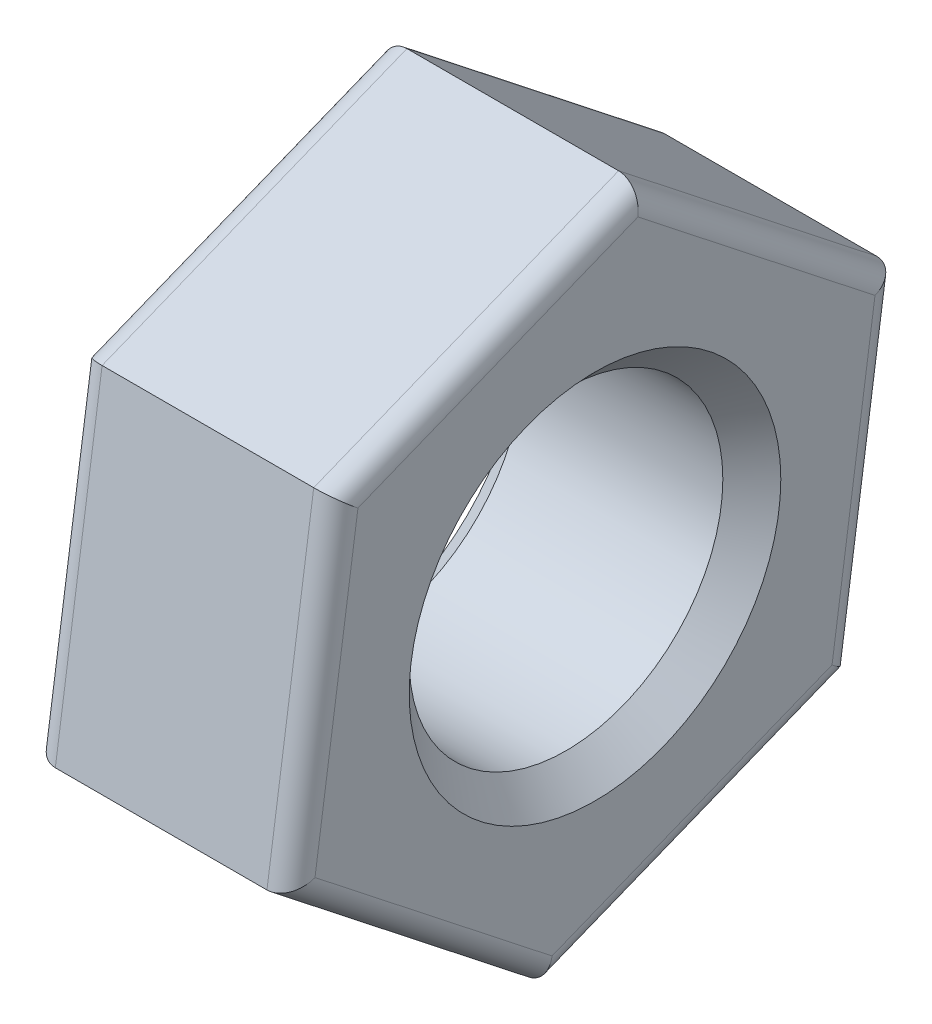
ISO-10303-21;
HEADER;
FILE_DESCRIPTION(('STEP AP214'),'2;1');
FILE_NAME('part.step','',(''),(''),'','','');
FILE_SCHEMA(('AUTOMOTIVE_DESIGN { 1 0 10303 214 1 1 1 1 }'));
ENDSEC;
DATA;
#1=APPLICATION_CONTEXT('core data for automotive mechanical design processes');
#2=APPLICATION_PROTOCOL_DEFINITION('international standard','automotive_design',2000,#1);
#3=PRODUCT_CONTEXT('',#1,'mechanical');
#4=PRODUCT('Part','Part','',(#3));
#5=PRODUCT_RELATED_PRODUCT_CATEGORY('part','',(#4));
#6=PRODUCT_DEFINITION_FORMATION('','',#4);
#7=PRODUCT_DEFINITION_CONTEXT('part definition',#1,'design');
#8=PRODUCT_DEFINITION('design','',#6,#7);
#9=PRODUCT_DEFINITION_SHAPE('','',#8);
#10=(LENGTH_UNIT() NAMED_UNIT(*) SI_UNIT(.MILLI.,.METRE.));
#11=(NAMED_UNIT(*) PLANE_ANGLE_UNIT() SI_UNIT($,.RADIAN.));
#12=(NAMED_UNIT(*) SI_UNIT($,.STERADIAN.) SOLID_ANGLE_UNIT());
#13=UNCERTAINTY_MEASURE_WITH_UNIT(LENGTH_MEASURE(1.E-05),#10,'distance_accuracy_value','');
#14=(GEOMETRIC_REPRESENTATION_CONTEXT(3) GLOBAL_UNCERTAINTY_ASSIGNED_CONTEXT((#13)) GLOBAL_UNIT_ASSIGNED_CONTEXT((#10,
#11,#12)) REPRESENTATION_CONTEXT('',''));
#15=CARTESIAN_POINT('',(0.,0.,0.));
#16=DIRECTION('',(0.,0.,1.));
#17=DIRECTION('',(1.,0.,0.));
#18=AXIS2_PLACEMENT_3D('',#15,#16,#17);
#19=CARTESIAN_POINT('',(4.45,0.,0.));
#20=DIRECTION('',(1.,0.,0.));
#21=DIRECTION('',(0.,0.,-1.));
#22=AXIS2_PLACEMENT_3D('',#19,#20,#21);
#23=PLANE('',#22);
#24=DIRECTION('',(0.,0.371565497173367,-0.928406743464473));
#25=VECTOR('',#24,1.);
#26=CARTESIAN_POINT('',(4.45,-3.13023490701674,-4.30306047214002));
#27=LINE('',#26,#25);
#28=CARTESIAN_POINT('',(4.45,-5.14890047567232,0.740848989305314));
#29=VERTEX_POINT('',#28);
#30=CARTESIAN_POINT('',(4.45,-3.21604428294259,-4.08865411883735));
#31=VERTEX_POINT('',#30);
#32=EDGE_CURVE('E250',#29,#31,#27,.T.);
#33=ORIENTED_EDGE('',*,*,#32,.T.);
#34=DIRECTION('',(0.,0.9898065734717,-0.142418212010306));
#35=VECTOR('',#34,1.);
#36=CARTESIAN_POINT('',(4.45,2.16144222938555,-4.86239318535933));
#37=LINE('',#36,#35);
#38=CARTESIAN_POINT('',(4.45,1.93285619272973,-4.82950310814267));
#39=VERTEX_POINT('',#38);
#40=EDGE_CURVE('E11',#31,#39,#37,.T.);
#41=ORIENTED_EDGE('',*,*,#40,.T.);
#42=DIRECTION('',(0.,0.618241076298333,0.785988531454167));
#43=VECTOR('',#42,1.);
#44=CARTESIAN_POINT('',(4.45,5.29167713640229,-0.559332713219306));
#45=LINE('',#44,#43);
#46=CARTESIAN_POINT('',(4.45,5.14890047567232,-0.740848989305315));
#47=VERTEX_POINT('',#46);
#48=EDGE_CURVE('E51',#39,#47,#45,.T.);
#49=ORIENTED_EDGE('',*,*,#48,.T.);
#50=DIRECTION('',(0.,-0.371565497173367,0.928406743464474));
#51=VECTOR('',#50,1.);
#52=CARTESIAN_POINT('',(4.45,3.13023490701674,4.30306047214002));
#53=LINE('',#52,#51);
#54=CARTESIAN_POINT('',(4.45,3.21604428294259,4.08865411883735));
#55=VERTEX_POINT('',#54);
#56=EDGE_CURVE('E259',#47,#55,#53,.T.);
#57=ORIENTED_EDGE('',*,*,#56,.T.);
#58=DIRECTION('',(0.,-0.9898065734717,0.142418212010306));
#59=VECTOR('',#58,1.);
#60=CARTESIAN_POINT('',(4.45,-2.16144222938555,4.86239318535933));
#61=LINE('',#60,#59);
#62=CARTESIAN_POINT('',(4.45,-1.93285619272973,4.82950310814266));
#63=VERTEX_POINT('',#62);
#64=EDGE_CURVE('E256',#55,#63,#61,.T.);
#65=ORIENTED_EDGE('',*,*,#64,.T.);
#66=DIRECTION('',(0.,-0.618241076298333,-0.785988531454168));
#67=VECTOR('',#66,1.);
#68=CARTESIAN_POINT('',(4.45,-5.29167713640229,0.559332713219305));
#69=LINE('',#68,#67);
#70=EDGE_CURVE('E253',#63,#29,#69,.T.);
#71=ORIENTED_EDGE('',*,*,#70,.T.);
#72=EDGE_LOOP('',(#33,#41,#49,#57,#65,#71));
#73=FACE_BOUND('',#72,.T.);
#74=CARTESIAN_POINT('',(4.45,0.,0.));
#75=DIRECTION('',(1.,0.,0.));
#76=DIRECTION('',(0.,0.,-1.));
#77=AXIS2_PLACEMENT_3D('',#74,#75,#76);
#78=CIRCLE('',#77,3.205);
#79=CARTESIAN_POINT('',(4.45,0.,-3.205));
#80=VERTEX_POINT('',#79);
#81=EDGE_CURVE('E152',#80,#80,#78,.F.);
#82=ORIENTED_EDGE('',*,*,#81,.T.);
#83=EDGE_LOOP('',(#82));
#84=FACE_BOUND('',#83,.T.);
#85=ADVANCED_FACE('F41',(#73,#84),#23,.T.);
#86=CARTESIAN_POINT('',(0.,0.,0.));
#87=DIRECTION('',(1.,0.,0.));
#88=DIRECTION('',(0.,0.,-1.));
#89=AXIS2_PLACEMENT_3D('',#86,#87,#88);
#90=PLANE('',#89);
#91=DIRECTION('',(0.,0.9898065734717,-0.142418212010306));
#92=VECTOR('',#91,1.);
#93=CARTESIAN_POINT('',(0.,-0.64159404510643,-4.45907861349001));
#94=LINE('',#93,#92);
#95=CARTESIAN_POINT('',(0.,1.93285619272973,-4.82950310814267));
#96=VERTEX_POINT('',#95);
#97=CARTESIAN_POINT('',(0.,-3.21604428294259,-4.08865411883735));
#98=VERTEX_POINT('',#97);
#99=EDGE_CURVE('E218',#96,#98,#94,.F.);
#100=ORIENTED_EDGE('',*,*,#99,.T.);
#101=DIRECTION('',(0.,0.371565497173367,-0.928406743464473));
#102=VECTOR('',#101,1.);
#103=CARTESIAN_POINT('',(0.,-4.18247237930745,-1.67390256476602));
#104=LINE('',#103,#102);
#105=CARTESIAN_POINT('',(0.,-5.14890047567232,0.740848989305313));
#106=VERTEX_POINT('',#105);
#107=EDGE_CURVE('E163',#98,#106,#104,.F.);
#108=ORIENTED_EDGE('',*,*,#107,.T.);
#109=DIRECTION('',(0.,-0.618241076298333,-0.785988531454168));
#110=VECTOR('',#109,1.);
#111=CARTESIAN_POINT('',(0.,-3.54087833420103,2.78517604872399));
#112=LINE('',#111,#110);
#113=CARTESIAN_POINT('',(0.,-1.93285619272973,4.82950310814266));
#114=VERTEX_POINT('',#113);
#115=EDGE_CURVE('E206',#106,#114,#112,.F.);
#116=ORIENTED_EDGE('',*,*,#115,.T.);
#117=DIRECTION('',(0.,-0.9898065734717,0.142418212010306));
#118=VECTOR('',#117,1.);
#119=CARTESIAN_POINT('',(0.,0.641594045106429,4.45907861349001));
#120=LINE('',#119,#118);
#121=CARTESIAN_POINT('',(0.,3.21604428294259,4.08865411883735));
#122=VERTEX_POINT('',#121);
#123=EDGE_CURVE('E209',#114,#122,#120,.F.);
#124=ORIENTED_EDGE('',*,*,#123,.T.);
#125=DIRECTION('',(0.,-0.371565497173367,0.928406743464474));
#126=VECTOR('',#125,1.);
#127=CARTESIAN_POINT('',(0.,4.18247237930745,1.67390256476602));
#128=LINE('',#127,#126);
#129=CARTESIAN_POINT('',(0.,5.14890047567232,-0.740848989305315));
#130=VERTEX_POINT('',#129);
#131=EDGE_CURVE('E212',#122,#130,#128,.F.);
#132=ORIENTED_EDGE('',*,*,#131,.T.);
#133=DIRECTION('',(0.,0.618241076298333,0.785988531454167));
#134=VECTOR('',#133,1.);
#135=CARTESIAN_POINT('',(0.,3.54087833420103,-2.78517604872399));
#136=LINE('',#135,#134);
#137=EDGE_CURVE('E215',#130,#96,#136,.F.);
#138=ORIENTED_EDGE('',*,*,#137,.T.);
#139=EDGE_LOOP('',(#100,#108,#116,#124,#132,#138));
#140=FACE_BOUND('',#139,.T.);
#141=CARTESIAN_POINT('',(0.,0.,0.));
#142=DIRECTION('',(1.,0.,0.));
#143=DIRECTION('',(0.,0.,-1.));
#144=AXIS2_PLACEMENT_3D('',#141,#142,#143);
#145=CIRCLE('',#144,3.205);
#146=CARTESIAN_POINT('',(0.,0.,-3.205));
#147=VERTEX_POINT('',#146);
#148=EDGE_CURVE('E189',#147,#147,#145,.T.);
#149=ORIENTED_EDGE('',*,*,#148,.T.);
#150=EDGE_LOOP('',(#149));
#151=FACE_BOUND('',#150,.T.);
#152=ADVANCED_FACE('F328',(#140,#151),#90,.F.);
#153=CARTESIAN_POINT('',(4.45,2.10447494458143,-5.25831581474801));
#154=DIRECTION('',(0.,-0.785988531454167,0.618241076298333));
#155=DIRECTION('',(0.,-0.618241076298333,-0.785988531454167));
#156=AXIS2_PLACEMENT_3D('',#153,#154,#155);
#157=PLANE('',#156);
#158=DIRECTION('',(-1.,0.,0.));
#159=VECTOR('',#158,1.);
#160=CARTESIAN_POINT('',(4.45,2.10447494458143,-5.25831581474801));
#161=LINE('',#160,#159);
#162=CARTESIAN_POINT('',(4.05,2.10447494458143,-5.25831581474801));
#163=VERTEX_POINT('',#162);
#164=CARTESIAN_POINT('',(0.4,2.10447494458143,-5.25831581474801));
#165=VERTEX_POINT('',#164);
#166=EDGE_CURVE('E160',#163,#165,#161,.T.);
#167=ORIENTED_EDGE('',*,*,#166,.T.);
#168=DIRECTION('',(0.,0.618241076298333,0.785988531454167));
#169=VECTOR('',#168,1.);
#170=CARTESIAN_POINT('',(0.4,2.10447494458143,-5.25831581474801));
#171=LINE('',#170,#169);
#172=CARTESIAN_POINT('',(0.4,5.60607254898396,-0.80662914373864));
#173=VERTEX_POINT('',#172);
#174=EDGE_CURVE('E229',#165,#173,#171,.T.);
#175=ORIENTED_EDGE('',*,*,#174,.T.);
#176=DIRECTION('',(-1.,0.,0.));
#177=VECTOR('',#176,1.);
#178=CARTESIAN_POINT('',(4.45,5.60607254898396,-0.80662914373864));
#179=LINE('',#178,#177);
#180=CARTESIAN_POINT('',(4.05,5.60607254898396,-0.80662914373864));
#181=VERTEX_POINT('',#180);
#182=EDGE_CURVE('E185',#181,#173,#179,.T.);
#183=ORIENTED_EDGE('',*,*,#182,.F.);
#184=DIRECTION('',(0.,0.618241076298333,0.785988531454167));
#185=VECTOR('',#184,1.);
#186=CARTESIAN_POINT('',(4.05,2.10447494458143,-5.25831581474801));
#187=LINE('',#186,#185);
#188=EDGE_CURVE('E226',#181,#163,#187,.F.);
#189=ORIENTED_EDGE('',*,*,#188,.T.);
#190=EDGE_LOOP('',(#167,#175,#183,#189));
#191=FACE_BOUND('',#190,.T.);
#192=ADVANCED_FACE('F349',(#191),#157,.F.);
#193=CARTESIAN_POINT('',(4.45,5.60607254898396,-0.80662914373864));
#194=DIRECTION('',(0.,-0.928406743464473,-0.371565497173367));
#195=DIRECTION('',(0.,0.371565497173367,-0.928406743464474));
#196=AXIS2_PLACEMENT_3D('',#193,#194,#195);
#197=PLANE('',#196);
#198=ORIENTED_EDGE('',*,*,#182,.T.);
#199=DIRECTION('',(0.,-0.371565497173367,0.928406743464474));
#200=VECTOR('',#199,1.);
#201=CARTESIAN_POINT('',(0.4,5.60607254898396,-0.80662914373864));
#202=LINE('',#201,#200);
#203=CARTESIAN_POINT('',(0.4,3.50159760440253,4.45168667100937));
#204=VERTEX_POINT('',#203);
#205=EDGE_CURVE('E235',#173,#204,#202,.T.);
#206=ORIENTED_EDGE('',*,*,#205,.T.);
#207=DIRECTION('',(-1.,0.,0.));
#208=VECTOR('',#207,1.);
#209=CARTESIAN_POINT('',(4.45,3.50159760440253,4.45168667100937));
#210=LINE('',#209,#208);
#211=CARTESIAN_POINT('',(4.05,3.50159760440253,4.45168667100937));
#212=VERTEX_POINT('',#211);
#213=EDGE_CURVE('E181',#212,#204,#210,.T.);
#214=ORIENTED_EDGE('',*,*,#213,.F.);
#215=DIRECTION('',(0.,-0.371565497173367,0.928406743464474));
#216=VECTOR('',#215,1.);
#217=CARTESIAN_POINT('',(4.05,5.60607254898396,-0.80662914373864));
#218=LINE('',#217,#216);
#219=EDGE_CURVE('E232',#212,#181,#218,.F.);
#220=ORIENTED_EDGE('',*,*,#219,.T.);
#221=EDGE_LOOP('',(#198,#206,#214,#220));
#222=FACE_BOUND('',#221,.T.);
#223=ADVANCED_FACE('F313',(#222),#197,.F.);
#224=CARTESIAN_POINT('',(4.45,3.50159760440253,4.45168667100937));
#225=DIRECTION('',(0.,-0.142418212010306,-0.9898065734717));
#226=DIRECTION('',(0.,0.9898065734717,-0.142418212010306));
#227=AXIS2_PLACEMENT_3D('',#224,#225,#226);
#228=PLANE('',#227);
#229=ORIENTED_EDGE('',*,*,#213,.T.);
#230=DIRECTION('',(0.,-0.9898065734717,0.142418212010306));
#231=VECTOR('',#230,1.);
#232=CARTESIAN_POINT('',(0.4,3.50159760440253,4.45168667100937));
#233=LINE('',#232,#231);
#234=CARTESIAN_POINT('',(0.4,-2.10447494458143,5.25831581474801));
#235=VERTEX_POINT('',#234);
#236=EDGE_CURVE('E241',#204,#235,#233,.T.);
#237=ORIENTED_EDGE('',*,*,#236,.T.);
#238=DIRECTION('',(-1.,0.,0.));
#239=VECTOR('',#238,1.);
#240=CARTESIAN_POINT('',(4.45,-2.10447494458143,5.25831581474801));
#241=LINE('',#240,#239);
#242=CARTESIAN_POINT('',(4.05,-2.10447494458143,5.25831581474801));
#243=VERTEX_POINT('',#242);
#244=EDGE_CURVE('E173',#243,#235,#241,.T.);
#245=ORIENTED_EDGE('',*,*,#244,.F.);
#246=DIRECTION('',(0.,-0.9898065734717,0.142418212010306));
#247=VECTOR('',#246,1.);
#248=CARTESIAN_POINT('',(4.05,3.50159760440253,4.45168667100937));
#249=LINE('',#248,#247);
#250=EDGE_CURVE('E238',#243,#212,#249,.F.);
#251=ORIENTED_EDGE('',*,*,#250,.T.);
#252=EDGE_LOOP('',(#229,#237,#245,#251));
#253=FACE_BOUND('',#252,.T.);
#254=ADVANCED_FACE('F310',(#253),#228,.F.);
#255=CARTESIAN_POINT('',(4.45,-2.10447494458143,5.25831581474801));
#256=DIRECTION('',(0.,0.785988531454168,-0.618241076298333));
#257=DIRECTION('',(0.,0.618241076298333,0.785988531454168));
#258=AXIS2_PLACEMENT_3D('',#255,#256,#257);
#259=PLANE('',#258);
#260=ORIENTED_EDGE('',*,*,#244,.T.);
#261=DIRECTION('',(0.,-0.618241076298333,-0.785988531454168));
#262=VECTOR('',#261,1.);
#263=CARTESIAN_POINT('',(0.4,-2.10447494458143,5.25831581474801));
#264=LINE('',#263,#262);
#265=CARTESIAN_POINT('',(0.4,-5.60607254898396,0.806629143738637));
#266=VERTEX_POINT('',#265);
#267=EDGE_CURVE('E247',#235,#266,#264,.T.);
#268=ORIENTED_EDGE('',*,*,#267,.T.);
#269=DIRECTION('',(-1.,0.,0.));
#270=VECTOR('',#269,1.);
#271=CARTESIAN_POINT('',(4.45,-5.60607254898396,0.806629143738637));
#272=LINE('',#271,#270);
#273=CARTESIAN_POINT('',(4.05,-5.60607254898396,0.806629143738637));
#274=VERTEX_POINT('',#273);
#275=EDGE_CURVE('E169',#274,#266,#272,.T.);
#276=ORIENTED_EDGE('',*,*,#275,.F.);
#277=DIRECTION('',(0.,-0.618241076298333,-0.785988531454168));
#278=VECTOR('',#277,1.);
#279=CARTESIAN_POINT('',(4.05,-2.10447494458143,5.25831581474801));
#280=LINE('',#279,#278);
#281=EDGE_CURVE('E244',#274,#243,#280,.F.);
#282=ORIENTED_EDGE('',*,*,#281,.T.);
#283=EDGE_LOOP('',(#260,#268,#276,#282));
#284=FACE_BOUND('',#283,.T.);
#285=ADVANCED_FACE('F337',(#284),#259,.F.);
#286=CARTESIAN_POINT('',(4.45,-5.60607254898396,0.806629143738637));
#287=DIRECTION('',(0.,0.928406743464473,0.371565497173367));
#288=DIRECTION('',(0.,-0.371565497173367,0.928406743464473));
#289=AXIS2_PLACEMENT_3D('',#286,#287,#288);
#290=PLANE('',#289);
#291=ORIENTED_EDGE('',*,*,#275,.T.);
#292=DIRECTION('',(0.,0.371565497173367,-0.928406743464473));
#293=VECTOR('',#292,1.);
#294=CARTESIAN_POINT('',(0.4,-5.60607254898396,0.806629143738637));
#295=LINE('',#294,#293);
#296=CARTESIAN_POINT('',(0.4,-3.50159760440253,-4.45168667100937));
#297=VERTEX_POINT('',#296);
#298=EDGE_CURVE('E151',#266,#297,#295,.T.);
#299=ORIENTED_EDGE('',*,*,#298,.T.);
#300=DIRECTION('',(-1.,0.,0.));
#301=VECTOR('',#300,1.);
#302=CARTESIAN_POINT('',(4.45,-3.50159760440253,-4.45168667100937));
#303=LINE('',#302,#301);
#304=CARTESIAN_POINT('',(4.05,-3.50159760440253,-4.45168667100937));
#305=VERTEX_POINT('',#304);
#306=EDGE_CURVE('E158',#305,#297,#303,.T.);
#307=ORIENTED_EDGE('',*,*,#306,.F.);
#308=DIRECTION('',(0.,0.371565497173367,-0.928406743464473));
#309=VECTOR('',#308,1.);
#310=CARTESIAN_POINT('',(4.05,-5.60607254898396,0.806629143738638));
#311=LINE('',#310,#309);
#312=EDGE_CURVE('E142',#305,#274,#311,.F.);
#313=ORIENTED_EDGE('',*,*,#312,.T.);
#314=EDGE_LOOP('',(#291,#299,#307,#313));
#315=FACE_BOUND('',#314,.T.);
#316=ADVANCED_FACE('F166',(#315),#290,.F.);
#317=CARTESIAN_POINT('',(4.45,-3.50159760440253,-4.45168667100937));
#318=DIRECTION('',(0.,0.142418212010306,0.9898065734717));
#319=DIRECTION('',(0.,-0.9898065734717,0.142418212010306));
#320=AXIS2_PLACEMENT_3D('',#317,#318,#319);
#321=PLANE('',#320);
#322=ORIENTED_EDGE('',*,*,#306,.T.);
#323=DIRECTION('',(0.,0.9898065734717,-0.142418212010306));
#324=VECTOR('',#323,1.);
#325=CARTESIAN_POINT('',(0.4,-3.50159760440253,-4.45168667100937));
#326=LINE('',#325,#324);
#327=EDGE_CURVE('E162',#297,#165,#326,.T.);
#328=ORIENTED_EDGE('',*,*,#327,.T.);
#329=ORIENTED_EDGE('',*,*,#166,.F.);
#330=DIRECTION('',(0.,0.9898065734717,-0.142418212010306));
#331=VECTOR('',#330,1.);
#332=CARTESIAN_POINT('',(4.05,-3.50159760440253,-4.45168667100937));
#333=LINE('',#332,#331);
#334=EDGE_CURVE('E135',#163,#305,#333,.F.);
#335=ORIENTED_EDGE('',*,*,#334,.T.);
#336=EDGE_LOOP('',(#322,#328,#329,#335));
#337=FACE_BOUND('',#336,.T.);
#338=ADVANCED_FACE('F157',(#337),#321,.F.);
#339=CARTESIAN_POINT('',(4.45,0.,0.));
#340=DIRECTION('',(-1.,0.,0.));
#341=DIRECTION('',(0.,0.,1.));
#342=AXIS2_PLACEMENT_3D('',#339,#340,#341);
#343=CYLINDRICAL_SURFACE('',#342,2.705);
#344=CARTESIAN_POINT('',(0.500000000000003,0.,0.));
#345=DIRECTION('',(1.,0.,0.));
#346=DIRECTION('',(0.,0.,-1.));
#347=AXIS2_PLACEMENT_3D('',#344,#345,#346);
#348=CIRCLE('',#347,2.705);
#349=CARTESIAN_POINT('',(0.500000000000003,0.,-2.705));
#350=VERTEX_POINT('',#349);
#351=EDGE_CURVE('E197',#350,#350,#348,.F.);
#352=ORIENTED_EDGE('',*,*,#351,.T.);
#353=EDGE_LOOP('',(#352));
#354=FACE_BOUND('',#353,.T.);
#355=CARTESIAN_POINT('',(3.95,0.,0.));
#356=DIRECTION('',(1.,0.,0.));
#357=DIRECTION('',(0.,0.,-1.));
#358=AXIS2_PLACEMENT_3D('',#355,#356,#357);
#359=CIRCLE('',#358,2.705);
#360=CARTESIAN_POINT('',(3.95,0.,-2.705));
#361=VERTEX_POINT('',#360);
#362=EDGE_CURVE('E193',#361,#361,#359,.T.);
#363=ORIENTED_EDGE('',*,*,#362,.T.);
#364=EDGE_LOOP('',(#363));
#365=FACE_BOUND('',#364,.T.);
#366=ADVANCED_FACE('F370',(#354,#365),#343,.F.);
#367=CARTESIAN_POINT('',(0.,0.,0.));
#368=DIRECTION('',(-1.,0.,0.));
#369=DIRECTION('',(0.,0.,1.));
#370=AXIS2_PLACEMENT_3D('',#367,#368,#369);
#371=CONICAL_SURFACE('',#370,3.205,0.785398163397448);
#372=ORIENTED_EDGE('',*,*,#351,.F.);
#373=EDGE_LOOP('',(#372));
#374=FACE_BOUND('',#373,.T.);
#375=ORIENTED_EDGE('',*,*,#148,.F.);
#376=EDGE_LOOP('',(#375));
#377=FACE_BOUND('',#376,.T.);
#378=ADVANCED_FACE('F385',(#374,#377),#371,.F.);
#379=CARTESIAN_POINT('',(3.95,0.,0.));
#380=DIRECTION('',(1.,0.,0.));
#381=DIRECTION('',(0.,0.,-1.));
#382=AXIS2_PLACEMENT_3D('',#379,#380,#381);
#383=CONICAL_SURFACE('',#382,2.705,0.785398163397447);
#384=ORIENTED_EDGE('',*,*,#81,.F.);
#385=EDGE_LOOP('',(#384));
#386=FACE_BOUND('',#385,.T.);
#387=ORIENTED_EDGE('',*,*,#362,.F.);
#388=EDGE_LOOP('',(#387));
#389=FACE_BOUND('',#388,.T.);
#390=ADVANCED_FACE('F391',(#386,#389),#383,.F.);
#391=CARTESIAN_POINT('',(0.4,5.23470985159817,-0.955255342607986));
#392=DIRECTION('',(0.,-0.371565497173367,0.928406743464474));
#393=DIRECTION('',(0.,-0.928406743464474,-0.371565497173367));
#394=AXIS2_PLACEMENT_3D('',#391,#392,#393);
#395=CYLINDRICAL_SURFACE('',#394,0.4);
#396=CARTESIAN_POINT('',(0.4,5.14890047567232,-0.740848989305315));
#397=DIRECTION('',(0.,0.142418212010306,0.9898065734717));
#398=DIRECTION('',(0.,-0.9898065734717,0.142418212010306));
#399=AXIS2_PLACEMENT_3D('',#396,#397,#398);
#400=ELLIPSE('',#399,0.461880215351701,0.4);
#401=EDGE_CURVE('E278',#130,#173,#400,.F.);
#402=ORIENTED_EDGE('',*,*,#401,.F.);
#403=ORIENTED_EDGE('',*,*,#131,.F.);
#404=CARTESIAN_POINT('',(0.4,3.21604428294259,4.08865411883735));
#405=DIRECTION('',(0.,-0.785988531454167,0.618241076298333));
#406=DIRECTION('',(0.,-0.618241076298333,-0.785988531454168));
#407=AXIS2_PLACEMENT_3D('',#404,#405,#406);
#408=ELLIPSE('',#407,0.461880215351701,0.4);
#409=EDGE_CURVE('E175',#204,#122,#408,.T.);
#410=ORIENTED_EDGE('',*,*,#409,.F.);
#411=ORIENTED_EDGE('',*,*,#205,.F.);
#412=EDGE_LOOP('',(#402,#403,#410,#411));
#413=FACE_BOUND('',#412,.T.);
#414=ADVANCED_FACE('F318',(#413),#395,.T.);
#415=CARTESIAN_POINT('',(0.4,3.44463031959841,4.05576404162069));
#416=DIRECTION('',(0.,-0.9898065734717,0.142418212010306));
#417=DIRECTION('',(0.,-0.142418212010306,-0.9898065734717));
#418=AXIS2_PLACEMENT_3D('',#415,#416,#417);
#419=CYLINDRICAL_SURFACE('',#418,0.4);
#420=ORIENTED_EDGE('',*,*,#409,.T.);
#421=ORIENTED_EDGE('',*,*,#123,.F.);
#422=CARTESIAN_POINT('',(0.4,-1.93285619272973,4.82950310814267));
#423=DIRECTION('',(0.,-0.928406743464474,-0.371565497173367));
#424=DIRECTION('',(0.,0.371565497173367,-0.928406743464474));
#425=AXIS2_PLACEMENT_3D('',#422,#423,#424);
#426=ELLIPSE('',#425,0.461880215351701,0.4);
#427=EDGE_CURVE('E274',#235,#114,#426,.T.);
#428=ORIENTED_EDGE('',*,*,#427,.F.);
#429=ORIENTED_EDGE('',*,*,#236,.F.);
#430=EDGE_LOOP('',(#420,#421,#428,#429));
#431=FACE_BOUND('',#430,.T.);
#432=ADVANCED_FACE('F333',(#431),#419,.T.);
#433=CARTESIAN_POINT('',(0.4,1.79007953199976,-5.01101938422867));
#434=DIRECTION('',(0.,0.618241076298333,0.785988531454167));
#435=DIRECTION('',(0.,-0.785988531454167,0.618241076298333));
#436=AXIS2_PLACEMENT_3D('',#433,#434,#435);
#437=CYLINDRICAL_SURFACE('',#436,0.4);
#438=ORIENTED_EDGE('',*,*,#401,.T.);
#439=ORIENTED_EDGE('',*,*,#174,.F.);
#440=CARTESIAN_POINT('',(0.4,1.93285619272973,-4.82950310814267));
#441=DIRECTION('',(0.,0.928406743464474,0.371565497173367));
#442=DIRECTION('',(0.,-0.371565497173367,0.928406743464474));
#443=AXIS2_PLACEMENT_3D('',#440,#441,#442);
#444=ELLIPSE('',#443,0.461880215351701,0.4);
#445=EDGE_CURVE('E270',#96,#165,#444,.F.);
#446=ORIENTED_EDGE('',*,*,#445,.F.);
#447=ORIENTED_EDGE('',*,*,#137,.F.);
#448=EDGE_LOOP('',(#438,#439,#446,#447));
#449=FACE_BOUND('',#448,.T.);
#450=ADVANCED_FACE('F324',(#449),#437,.T.);
#451=CARTESIAN_POINT('',(0.4,-1.79007953199976,5.01101938422867));
#452=DIRECTION('',(0.,-0.618241076298333,-0.785988531454168));
#453=DIRECTION('',(0.,0.785988531454168,-0.618241076298333));
#454=AXIS2_PLACEMENT_3D('',#451,#452,#453);
#455=CYLINDRICAL_SURFACE('',#454,0.4);
#456=ORIENTED_EDGE('',*,*,#427,.T.);
#457=ORIENTED_EDGE('',*,*,#115,.F.);
#458=CARTESIAN_POINT('',(0.4,-5.14890047567232,0.740848989305314));
#459=DIRECTION('',(0.,-0.142418212010306,-0.9898065734717));
#460=DIRECTION('',(0.,-0.9898065734717,0.142418212010306));
#461=AXIS2_PLACEMENT_3D('',#458,#459,#460);
#462=ELLIPSE('',#461,0.461880215351701,0.4);
#463=EDGE_CURVE('E267',#266,#106,#462,.T.);
#464=ORIENTED_EDGE('',*,*,#463,.F.);
#465=ORIENTED_EDGE('',*,*,#267,.F.);
#466=EDGE_LOOP('',(#456,#457,#464,#465));
#467=FACE_BOUND('',#466,.T.);
#468=ADVANCED_FACE('F341',(#467),#455,.T.);
#469=CARTESIAN_POINT('',(0.4,-3.44463031959841,-4.05576404162069));
#470=DIRECTION('',(0.,0.9898065734717,-0.142418212010306));
#471=DIRECTION('',(0.,0.142418212010306,0.9898065734717));
#472=AXIS2_PLACEMENT_3D('',#469,#470,#471);
#473=CYLINDRICAL_SURFACE('',#472,0.4);
#474=ORIENTED_EDGE('',*,*,#445,.T.);
#475=ORIENTED_EDGE('',*,*,#327,.F.);
#476=CARTESIAN_POINT('',(0.4,-3.21604428294259,-4.08865411883735));
#477=DIRECTION('',(0.,0.785988531454167,-0.618241076298333));
#478=DIRECTION('',(0.,0.618241076298333,0.785988531454167));
#479=AXIS2_PLACEMENT_3D('',#476,#477,#478);
#480=ELLIPSE('',#479,0.461880215351701,0.4);
#481=EDGE_CURVE('E264',#98,#297,#480,.F.);
#482=ORIENTED_EDGE('',*,*,#481,.F.);
#483=ORIENTED_EDGE('',*,*,#99,.F.);
#484=EDGE_LOOP('',(#474,#475,#482,#483));
#485=FACE_BOUND('',#484,.T.);
#486=ADVANCED_FACE('F347',(#485),#473,.T.);
#487=CARTESIAN_POINT('',(0.4,-5.23470985159817,0.955255342607984));
#488=DIRECTION('',(0.,0.371565497173367,-0.928406743464473));
#489=DIRECTION('',(0.,0.928406743464473,0.371565497173367));
#490=AXIS2_PLACEMENT_3D('',#487,#488,#489);
#491=CYLINDRICAL_SURFACE('',#490,0.4);
#492=ORIENTED_EDGE('',*,*,#463,.T.);
#493=ORIENTED_EDGE('',*,*,#107,.F.);
#494=ORIENTED_EDGE('',*,*,#481,.T.);
#495=ORIENTED_EDGE('',*,*,#298,.F.);
#496=EDGE_LOOP('',(#492,#493,#494,#495));
#497=FACE_BOUND('',#496,.T.);
#498=ADVANCED_FACE('F343',(#497),#491,.T.);
#499=CARTESIAN_POINT('',(4.05,0.641594045106429,4.45907861349001));
#500=DIRECTION('',(0.,0.9898065734717,-0.142418212010306));
#501=DIRECTION('',(0.,0.142418212010306,0.9898065734717));
#502=AXIS2_PLACEMENT_3D('',#499,#500,#501);
#503=CYLINDRICAL_SURFACE('',#502,0.4);
#504=CARTESIAN_POINT('',(4.05,3.21604428294259,4.08865411883735));
#505=DIRECTION('',(0.,0.785988531454167,-0.618241076298333));
#506=DIRECTION('',(0.,0.618241076298333,0.785988531454168));
#507=AXIS2_PLACEMENT_3D('',#504,#505,#506);
#508=ELLIPSE('',#507,0.461880215351701,0.4);
#509=EDGE_CURVE('E291',#212,#55,#508,.T.);
#510=ORIENTED_EDGE('',*,*,#509,.F.);
#511=ORIENTED_EDGE('',*,*,#250,.F.);
#512=CARTESIAN_POINT('',(4.05,-1.93285619272973,4.82950310814266));
#513=DIRECTION('',(0.,0.928406743464474,0.371565497173367));
#514=DIRECTION('',(0.,-0.371565497173367,0.928406743464474));
#515=AXIS2_PLACEMENT_3D('',#512,#513,#514);
#516=ELLIPSE('',#515,0.461880215351701,0.4);
#517=EDGE_CURVE('E45',#63,#243,#516,.F.);
#518=ORIENTED_EDGE('',*,*,#517,.F.);
#519=ORIENTED_EDGE('',*,*,#64,.F.);
#520=EDGE_LOOP('',(#510,#511,#518,#519));
#521=FACE_BOUND('',#520,.T.);
#522=ADVANCED_FACE('F43',(#521),#503,.T.);
#523=CARTESIAN_POINT('',(4.05,-3.54087833420103,2.78517604872399));
#524=DIRECTION('',(0.,0.618241076298333,0.785988531454168));
#525=DIRECTION('',(0.,-0.785988531454168,0.618241076298333));
#526=AXIS2_PLACEMENT_3D('',#523,#524,#525);
#527=CYLINDRICAL_SURFACE('',#526,0.4);
#528=ORIENTED_EDGE('',*,*,#517,.T.);
#529=ORIENTED_EDGE('',*,*,#281,.F.);
#530=CARTESIAN_POINT('',(4.05,-5.14890047567232,0.740848989305313));
#531=DIRECTION('',(0.,0.142418212010306,0.9898065734717));
#532=DIRECTION('',(0.,-0.9898065734717,0.142418212010306));
#533=AXIS2_PLACEMENT_3D('',#530,#531,#532);
#534=ELLIPSE('',#533,0.461880215351701,0.4);
#535=EDGE_CURVE('E145',#29,#274,#534,.F.);
#536=ORIENTED_EDGE('',*,*,#535,.F.);
#537=ORIENTED_EDGE('',*,*,#70,.F.);
#538=EDGE_LOOP('',(#528,#529,#536,#537));
#539=FACE_BOUND('',#538,.T.);
#540=ADVANCED_FACE('F303',(#539),#527,.T.);
#541=CARTESIAN_POINT('',(4.05,4.18247237930745,1.67390256476602));
#542=DIRECTION('',(0.,0.371565497173367,-0.928406743464474));
#543=DIRECTION('',(0.,0.928406743464474,0.371565497173367));
#544=AXIS2_PLACEMENT_3D('',#541,#542,#543);
#545=CYLINDRICAL_SURFACE('',#544,0.4);
#546=ORIENTED_EDGE('',*,*,#509,.T.);
#547=ORIENTED_EDGE('',*,*,#56,.F.);
#548=CARTESIAN_POINT('',(4.05,5.14890047567232,-0.740848989305315));
#549=DIRECTION('',(0.,-0.142418212010306,-0.9898065734717));
#550=DIRECTION('',(0.,0.9898065734717,-0.142418212010306));
#551=AXIS2_PLACEMENT_3D('',#548,#549,#550);
#552=ELLIPSE('',#551,0.461880215351701,0.4);
#553=EDGE_CURVE('E139',#181,#47,#552,.T.);
#554=ORIENTED_EDGE('',*,*,#553,.F.);
#555=ORIENTED_EDGE('',*,*,#219,.F.);
#556=EDGE_LOOP('',(#546,#547,#554,#555));
#557=FACE_BOUND('',#556,.T.);
#558=ADVANCED_FACE('F355',(#557),#545,.T.);
#559=CARTESIAN_POINT('',(4.05,-4.18247237930745,-1.67390256476602));
#560=DIRECTION('',(0.,-0.371565497173367,0.928406743464473));
#561=DIRECTION('',(0.,-0.928406743464473,-0.371565497173367));
#562=AXIS2_PLACEMENT_3D('',#559,#560,#561);
#563=CYLINDRICAL_SURFACE('',#562,0.4);
#564=ORIENTED_EDGE('',*,*,#535,.T.);
#565=ORIENTED_EDGE('',*,*,#312,.F.);
#566=CARTESIAN_POINT('',(4.05,-3.21604428294259,-4.08865411883735));
#567=DIRECTION('',(0.,-0.785988531454167,0.618241076298333));
#568=DIRECTION('',(0.,0.618241076298333,0.785988531454167));
#569=AXIS2_PLACEMENT_3D('',#566,#567,#568);
#570=ELLIPSE('',#569,0.461880215351701,0.4);
#571=EDGE_CURVE('E131',#31,#305,#570,.F.);
#572=ORIENTED_EDGE('',*,*,#571,.F.);
#573=ORIENTED_EDGE('',*,*,#32,.F.);
#574=EDGE_LOOP('',(#564,#565,#572,#573));
#575=FACE_BOUND('',#574,.T.);
#576=ADVANCED_FACE('F143',(#575),#563,.T.);
#577=CARTESIAN_POINT('',(4.05,3.54087833420103,-2.78517604872399));
#578=DIRECTION('',(0.,-0.618241076298333,-0.785988531454167));
#579=DIRECTION('',(0.,0.785988531454167,-0.618241076298333));
#580=AXIS2_PLACEMENT_3D('',#577,#578,#579);
#581=CYLINDRICAL_SURFACE('',#580,0.4);
#582=ORIENTED_EDGE('',*,*,#553,.T.);
#583=ORIENTED_EDGE('',*,*,#48,.F.);
#584=CARTESIAN_POINT('',(4.05,1.93285619272973,-4.82950310814267));
#585=DIRECTION('',(0.,-0.928406743464474,-0.371565497173367));
#586=DIRECTION('',(0.,0.371565497173367,-0.928406743464474));
#587=AXIS2_PLACEMENT_3D('',#584,#585,#586);
#588=ELLIPSE('',#587,0.461880215351701,0.4);
#589=EDGE_CURVE('E59',#163,#39,#588,.T.);
#590=ORIENTED_EDGE('',*,*,#589,.F.);
#591=ORIENTED_EDGE('',*,*,#188,.F.);
#592=EDGE_LOOP('',(#582,#583,#590,#591));
#593=FACE_BOUND('',#592,.T.);
#594=ADVANCED_FACE('F353',(#593),#581,.T.);
#595=CARTESIAN_POINT('',(4.05,-0.64159404510643,-4.45907861349001));
#596=DIRECTION('',(0.,-0.9898065734717,0.142418212010306));
#597=DIRECTION('',(0.,-0.142418212010306,-0.9898065734717));
#598=AXIS2_PLACEMENT_3D('',#595,#596,#597);
#599=CYLINDRICAL_SURFACE('',#598,0.4);
#600=ORIENTED_EDGE('',*,*,#571,.T.);
#601=ORIENTED_EDGE('',*,*,#334,.F.);
#602=ORIENTED_EDGE('',*,*,#589,.T.);
#603=ORIENTED_EDGE('',*,*,#40,.F.);
#604=EDGE_LOOP('',(#600,#601,#602,#603));
#605=FACE_BOUND('',#604,.T.);
#606=ADVANCED_FACE('F133',(#605),#599,.T.);
#607=CLOSED_SHELL('',(#85,#152,#192,#223,#254,#285,#316,#338,#366,#378,#390,#414,#432,#450,#468,
#486,#498,#522,#540,#558,#576,#594,#606));
#608=MANIFOLD_SOLID_BREP('B2',#607);
#609=ADVANCED_BREP_SHAPE_REPRESENTATION('',(#18,#608),#14);
#610=SHAPE_DEFINITION_REPRESENTATION(#9,#609);
ENDSEC;
END-ISO-10303-21;
